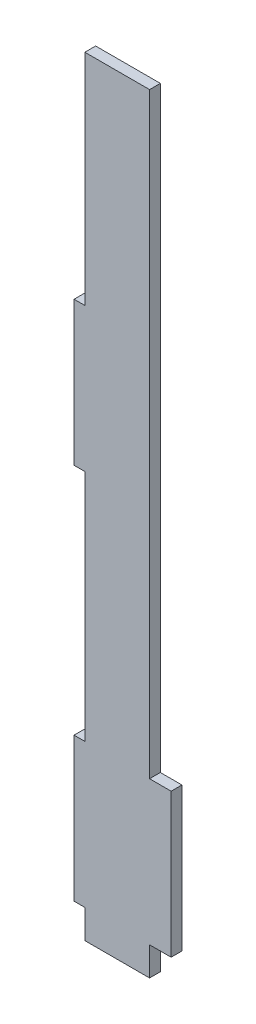
ISO-10303-21;
HEADER;
FILE_DESCRIPTION(('STEP AP214'),'2;1');
FILE_NAME('part.step','',(''),(''),'','','');
FILE_SCHEMA(('AUTOMOTIVE_DESIGN { 1 0 10303 214 1 1 1 1 }'));
ENDSEC;
DATA;
#1=APPLICATION_CONTEXT('core data for automotive mechanical design processes');
#2=APPLICATION_PROTOCOL_DEFINITION('international standard','automotive_design',2000,#1);
#3=PRODUCT_CONTEXT('',#1,'mechanical');
#4=PRODUCT('Part','Part','',(#3));
#5=PRODUCT_RELATED_PRODUCT_CATEGORY('part','',(#4));
#6=PRODUCT_DEFINITION_FORMATION('','',#4);
#7=PRODUCT_DEFINITION_CONTEXT('part definition',#1,'design');
#8=PRODUCT_DEFINITION('design','',#6,#7);
#9=PRODUCT_DEFINITION_SHAPE('','',#8);
#10=(LENGTH_UNIT() NAMED_UNIT(*) SI_UNIT(.MILLI.,.METRE.));
#11=(NAMED_UNIT(*) PLANE_ANGLE_UNIT() SI_UNIT($,.RADIAN.));
#12=(NAMED_UNIT(*) SI_UNIT($,.STERADIAN.) SOLID_ANGLE_UNIT());
#13=UNCERTAINTY_MEASURE_WITH_UNIT(LENGTH_MEASURE(1.E-05),#10,'distance_accuracy_value','');
#14=(GEOMETRIC_REPRESENTATION_CONTEXT(3) GLOBAL_UNCERTAINTY_ASSIGNED_CONTEXT((#13)) GLOBAL_UNIT_ASSIGNED_CONTEXT((#10,
#11,#12)) REPRESENTATION_CONTEXT('',''));
#15=CARTESIAN_POINT('',(0.,0.,0.));
#16=DIRECTION('',(0.,0.,1.));
#17=DIRECTION('',(1.,0.,0.));
#18=AXIS2_PLACEMENT_3D('',#15,#16,#17);
#19=CARTESIAN_POINT('',(-18.,61.,3.));
#20=DIRECTION('',(1.,0.,0.));
#21=DIRECTION('',(0.,1.,0.));
#22=AXIS2_PLACEMENT_3D('',#19,#20,#21);
#23=PLANE('',#22);
#24=DIRECTION('',(0.,-1.,0.));
#25=VECTOR('',#24,1.);
#26=CARTESIAN_POINT('',(-18.,61.,3.));
#27=LINE('',#26,#25);
#28=CARTESIAN_POINT('',(-18.,113.,3.));
#29=VERTEX_POINT('',#28);
#30=CARTESIAN_POINT('',(-18.,48.,3.));
#31=VERTEX_POINT('',#30);
#32=EDGE_CURVE('E50',#29,#31,#27,.T.);
#33=ORIENTED_EDGE('',*,*,#32,.F.);
#34=DIRECTION('',(0.,0.,1.));
#35=VECTOR('',#34,1.);
#36=CARTESIAN_POINT('',(-18.,113.,0.));
#37=LINE('',#36,#35);
#38=CARTESIAN_POINT('',(-18.,113.,0.));
#39=VERTEX_POINT('',#38);
#40=EDGE_CURVE('E179',#39,#29,#37,.T.);
#41=ORIENTED_EDGE('',*,*,#40,.F.);
#42=DIRECTION('',(0.,-1.,0.));
#43=VECTOR('',#42,1.);
#44=CARTESIAN_POINT('',(-18.,61.,0.));
#45=LINE('',#44,#43);
#46=CARTESIAN_POINT('',(-18.,48.,0.));
#47=VERTEX_POINT('',#46);
#48=EDGE_CURVE('E259',#39,#47,#45,.T.);
#49=ORIENTED_EDGE('',*,*,#48,.T.);
#50=DIRECTION('',(0.,0.,1.));
#51=VECTOR('',#50,1.);
#52=CARTESIAN_POINT('',(-18.,48.,-40.4474968323134));
#53=LINE('',#52,#51);
#54=EDGE_CURVE('E201',#47,#31,#53,.T.);
#55=ORIENTED_EDGE('',*,*,#54,.T.);
#56=EDGE_LOOP('',(#33,#41,#49,#55));
#57=FACE_BOUND('',#56,.T.);
#58=ADVANCED_FACE('F35',(#57),#23,.F.);
#59=DIRECTION('',(0.,0.,1.));
#60=VECTOR('',#59,1.);
#61=CARTESIAN_POINT('',(-18.,8.,-40.4474968323134));
#62=LINE('',#61,#60);
#63=CARTESIAN_POINT('',(-18.,8.00000000000001,0.));
#64=VERTEX_POINT('',#63);
#65=CARTESIAN_POINT('',(-18.,8.,3.));
#66=VERTEX_POINT('',#65);
#67=EDGE_CURVE('E203',#64,#66,#62,.T.);
#68=ORIENTED_EDGE('',*,*,#67,.F.);
#69=CARTESIAN_POINT('',(-18.,0.,0.));
#70=VERTEX_POINT('',#69);
#71=EDGE_CURVE('E246',#64,#70,#45,.T.);
#72=ORIENTED_EDGE('',*,*,#71,.T.);
#73=DIRECTION('',(0.,0.,-1.));
#74=VECTOR('',#73,1.);
#75=CARTESIAN_POINT('',(-18.,0.,3.));
#76=LINE('',#75,#74);
#77=CARTESIAN_POINT('',(-18.,0.,3.));
#78=VERTEX_POINT('',#77);
#79=EDGE_CURVE('E11',#78,#70,#76,.T.);
#80=ORIENTED_EDGE('',*,*,#79,.F.);
#81=EDGE_CURVE('E250',#66,#78,#27,.T.);
#82=ORIENTED_EDGE('',*,*,#81,.F.);
#83=EDGE_LOOP('',(#68,#72,#80,#82));
#84=FACE_BOUND('',#83,.T.);
#85=ADVANCED_FACE('F286',(#84),#23,.F.);
#86=CARTESIAN_POINT('',(0.,61.,3.));
#87=DIRECTION('',(-1.,0.,0.));
#88=DIRECTION('',(0.,0.,1.));
#89=AXIS2_PLACEMENT_3D('',#86,#87,#88);
#90=PLANE('',#89);
#91=DIRECTION('',(0.,0.,1.));
#92=VECTOR('',#91,1.);
#93=CARTESIAN_POINT('',(0.,48.,-40.4474968323134));
#94=LINE('',#93,#92);
#95=CARTESIAN_POINT('',(0.,48.,0.));
#96=VERTEX_POINT('',#95);
#97=CARTESIAN_POINT('',(0.,48.,3.));
#98=VERTEX_POINT('',#97);
#99=EDGE_CURVE('E240',#96,#98,#94,.T.);
#100=ORIENTED_EDGE('',*,*,#99,.F.);
#101=DIRECTION('',(0.,1.,0.));
#102=VECTOR('',#101,1.);
#103=CARTESIAN_POINT('',(0.,61.,0.));
#104=LINE('',#103,#102);
#105=CARTESIAN_POINT('',(0.,214.,0.));
#106=VERTEX_POINT('',#105);
#107=EDGE_CURVE('E261',#96,#106,#104,.T.);
#108=ORIENTED_EDGE('',*,*,#107,.T.);
#109=DIRECTION('',(0.,0.,-1.));
#110=VECTOR('',#109,1.);
#111=CARTESIAN_POINT('',(0.,214.,0.));
#112=LINE('',#111,#110);
#113=CARTESIAN_POINT('',(0.,214.,3.));
#114=VERTEX_POINT('',#113);
#115=EDGE_CURVE('E189',#114,#106,#112,.T.);
#116=ORIENTED_EDGE('',*,*,#115,.F.);
#117=DIRECTION('',(0.,1.,0.));
#118=VECTOR('',#117,1.);
#119=CARTESIAN_POINT('',(0.,61.,3.));
#120=LINE('',#119,#118);
#121=EDGE_CURVE('E252',#98,#114,#120,.T.);
#122=ORIENTED_EDGE('',*,*,#121,.F.);
#123=EDGE_LOOP('',(#100,#108,#116,#122));
#124=FACE_BOUND('',#123,.T.);
#125=ADVANCED_FACE('F311',(#124),#90,.F.);
#126=CARTESIAN_POINT('',(-18.,214.,0.));
#127=VERTEX_POINT('',#126);
#128=CARTESIAN_POINT('',(-18.,153.,0.));
#129=VERTEX_POINT('',#128);
#130=EDGE_CURVE('E256',#127,#129,#45,.T.);
#131=ORIENTED_EDGE('',*,*,#130,.T.);
#132=DIRECTION('',(0.,0.,1.));
#133=VECTOR('',#132,1.);
#134=CARTESIAN_POINT('',(-18.,153.,0.));
#135=LINE('',#134,#133);
#136=CARTESIAN_POINT('',(-18.,153.,3.));
#137=VERTEX_POINT('',#136);
#138=EDGE_CURVE('E58',#129,#137,#135,.T.);
#139=ORIENTED_EDGE('',*,*,#138,.T.);
#140=CARTESIAN_POINT('',(-18.,214.,3.));
#141=VERTEX_POINT('',#140);
#142=EDGE_CURVE('E247',#141,#137,#27,.T.);
#143=ORIENTED_EDGE('',*,*,#142,.F.);
#144=DIRECTION('',(0.,0.,1.));
#145=VECTOR('',#144,1.);
#146=CARTESIAN_POINT('',(-18.,214.,0.));
#147=LINE('',#146,#145);
#148=EDGE_CURVE('E181',#127,#141,#147,.T.);
#149=ORIENTED_EDGE('',*,*,#148,.F.);
#150=EDGE_LOOP('',(#131,#139,#143,#149));
#151=FACE_BOUND('',#150,.T.);
#152=ADVANCED_FACE('F37',(#151),#23,.F.);
#153=CARTESIAN_POINT('',(-18.,0.,3.));
#154=DIRECTION('',(0.,1.,0.));
#155=DIRECTION('',(0.,0.,1.));
#156=AXIS2_PLACEMENT_3D('',#153,#154,#155);
#157=PLANE('',#156);
#158=DIRECTION('',(1.,0.,0.));
#159=VECTOR('',#158,1.);
#160=CARTESIAN_POINT('',(-18.,0.,0.));
#161=LINE('',#160,#159);
#162=CARTESIAN_POINT('',(0.,0.,0.));
#163=VERTEX_POINT('',#162);
#164=EDGE_CURVE('E258',#70,#163,#161,.T.);
#165=ORIENTED_EDGE('',*,*,#164,.T.);
#166=DIRECTION('',(0.,0.,-1.));
#167=VECTOR('',#166,1.);
#168=CARTESIAN_POINT('',(0.,0.,3.));
#169=LINE('',#168,#167);
#170=CARTESIAN_POINT('',(0.,0.,3.));
#171=VERTEX_POINT('',#170);
#172=EDGE_CURVE('E43',#171,#163,#169,.T.);
#173=ORIENTED_EDGE('',*,*,#172,.F.);
#174=DIRECTION('',(1.,0.,0.));
#175=VECTOR('',#174,1.);
#176=CARTESIAN_POINT('',(-18.,0.,3.));
#177=LINE('',#176,#175);
#178=EDGE_CURVE('E249',#78,#171,#177,.T.);
#179=ORIENTED_EDGE('',*,*,#178,.F.);
#180=ORIENTED_EDGE('',*,*,#79,.T.);
#181=EDGE_LOOP('',(#165,#173,#179,#180));
#182=FACE_BOUND('',#181,.T.);
#183=ADVANCED_FACE('F284',(#182),#157,.F.);
#184=CARTESIAN_POINT('',(0.,8.,0.));
#185=VERTEX_POINT('',#184);
#186=EDGE_CURVE('E262',#163,#185,#104,.T.);
#187=ORIENTED_EDGE('',*,*,#186,.T.);
#188=DIRECTION('',(0.,0.,1.));
#189=VECTOR('',#188,1.);
#190=CARTESIAN_POINT('',(0.,8.,-40.4474968323134));
#191=LINE('',#190,#189);
#192=CARTESIAN_POINT('',(0.,8.00000000000001,3.));
#193=VERTEX_POINT('',#192);
#194=EDGE_CURVE('E226',#185,#193,#191,.T.);
#195=ORIENTED_EDGE('',*,*,#194,.T.);
#196=EDGE_CURVE('E253',#171,#193,#120,.T.);
#197=ORIENTED_EDGE('',*,*,#196,.F.);
#198=ORIENTED_EDGE('',*,*,#172,.T.);
#199=EDGE_LOOP('',(#187,#195,#197,#198));
#200=FACE_BOUND('',#199,.T.);
#201=ADVANCED_FACE('F269',(#200),#90,.F.);
#202=CARTESIAN_POINT('',(0.,0.,3.));
#203=DIRECTION('',(0.,0.,1.));
#204=DIRECTION('',(1.,0.,0.));
#205=AXIS2_PLACEMENT_3D('',#202,#203,#204);
#206=PLANE('',#205);
#207=ORIENTED_EDGE('',*,*,#142,.T.);
#208=DIRECTION('',(-1.,0.,0.));
#209=VECTOR('',#208,1.);
#210=CARTESIAN_POINT('',(-18.,153.,3.));
#211=LINE('',#210,#209);
#212=CARTESIAN_POINT('',(-21.,153.,3.));
#213=VERTEX_POINT('',#212);
#214=EDGE_CURVE('E176',#137,#213,#211,.T.);
#215=ORIENTED_EDGE('',*,*,#214,.T.);
#216=DIRECTION('',(0.,-1.,0.));
#217=VECTOR('',#216,1.);
#218=CARTESIAN_POINT('',(-21.,113.,3.));
#219=LINE('',#218,#217);
#220=CARTESIAN_POINT('',(-21.,113.,3.));
#221=VERTEX_POINT('',#220);
#222=EDGE_CURVE('E155',#213,#221,#219,.T.);
#223=ORIENTED_EDGE('',*,*,#222,.T.);
#224=DIRECTION('',(1.,0.,0.));
#225=VECTOR('',#224,1.);
#226=CARTESIAN_POINT('',(-18.,113.,3.));
#227=LINE('',#226,#225);
#228=EDGE_CURVE('E170',#221,#29,#227,.T.);
#229=ORIENTED_EDGE('',*,*,#228,.T.);
#230=ORIENTED_EDGE('',*,*,#32,.T.);
#231=DIRECTION('',(-1.,0.,0.));
#232=VECTOR('',#231,1.);
#233=CARTESIAN_POINT('',(-18.,48.,3.));
#234=LINE('',#233,#232);
#235=CARTESIAN_POINT('',(-21.,48.,3.));
#236=VERTEX_POINT('',#235);
#237=EDGE_CURVE('E206',#31,#236,#234,.T.);
#238=ORIENTED_EDGE('',*,*,#237,.T.);
#239=DIRECTION('',(0.,1.,0.));
#240=VECTOR('',#239,1.);
#241=CARTESIAN_POINT('',(-21.,8.,3.));
#242=LINE('',#241,#240);
#243=CARTESIAN_POINT('',(-21.,8.,3.));
#244=VERTEX_POINT('',#243);
#245=EDGE_CURVE('E209',#244,#236,#242,.T.);
#246=ORIENTED_EDGE('',*,*,#245,.F.);
#247=DIRECTION('',(-1.,0.,0.));
#248=VECTOR('',#247,1.);
#249=CARTESIAN_POINT('',(-18.,8.,3.));
#250=LINE('',#249,#248);
#251=EDGE_CURVE('E212',#66,#244,#250,.T.);
#252=ORIENTED_EDGE('',*,*,#251,.F.);
#253=ORIENTED_EDGE('',*,*,#81,.T.);
#254=ORIENTED_EDGE('',*,*,#178,.T.);
#255=ORIENTED_EDGE('',*,*,#196,.T.);
#256=DIRECTION('',(1.,0.,0.));
#257=VECTOR('',#256,1.);
#258=CARTESIAN_POINT('',(0.,8.,3.));
#259=LINE('',#258,#257);
#260=CARTESIAN_POINT('',(6.,8.,3.));
#261=VERTEX_POINT('',#260);
#262=EDGE_CURVE('E215',#193,#261,#259,.T.);
#263=ORIENTED_EDGE('',*,*,#262,.T.);
#264=DIRECTION('',(0.,1.,0.));
#265=VECTOR('',#264,1.);
#266=CARTESIAN_POINT('',(6.,0.,3.));
#267=LINE('',#266,#265);
#268=CARTESIAN_POINT('',(6.,48.,3.));
#269=VERTEX_POINT('',#268);
#270=EDGE_CURVE('E231',#261,#269,#267,.T.);
#271=ORIENTED_EDGE('',*,*,#270,.T.);
#272=DIRECTION('',(1.,0.,0.));
#273=VECTOR('',#272,1.);
#274=CARTESIAN_POINT('',(0.,48.,3.));
#275=LINE('',#274,#273);
#276=EDGE_CURVE('E234',#98,#269,#275,.T.);
#277=ORIENTED_EDGE('',*,*,#276,.F.);
#278=ORIENTED_EDGE('',*,*,#121,.T.);
#279=DIRECTION('',(1.,0.,0.));
#280=VECTOR('',#279,1.);
#281=CARTESIAN_POINT('',(-18.,214.,3.));
#282=LINE('',#281,#280);
#283=EDGE_CURVE('E186',#141,#114,#282,.T.);
#284=ORIENTED_EDGE('',*,*,#283,.F.);
#285=EDGE_LOOP('',(#207,#215,#223,#229,#230,#238,#246,#252,#253,#254,#255,#263,#271,#277,#278,#284));
#286=FACE_BOUND('',#285,.T.);
#287=ADVANCED_FACE('F281',(#286),#206,.T.);
#288=CARTESIAN_POINT('',(0.,0.,0.));
#289=DIRECTION('',(0.,0.,1.));
#290=DIRECTION('',(1.,0.,0.));
#291=AXIS2_PLACEMENT_3D('',#288,#289,#290);
#292=PLANE('',#291);
#293=ORIENTED_EDGE('',*,*,#130,.F.);
#294=DIRECTION('',(-1.,0.,0.));
#295=VECTOR('',#294,1.);
#296=CARTESIAN_POINT('',(-18.,214.,0.));
#297=LINE('',#296,#295);
#298=EDGE_CURVE('E192',#106,#127,#297,.T.);
#299=ORIENTED_EDGE('',*,*,#298,.F.);
#300=ORIENTED_EDGE('',*,*,#107,.F.);
#301=DIRECTION('',(-1.,0.,0.));
#302=VECTOR('',#301,1.);
#303=CARTESIAN_POINT('',(0.,48.,0.));
#304=LINE('',#303,#302);
#305=CARTESIAN_POINT('',(6.,48.,0.));
#306=VERTEX_POINT('',#305);
#307=EDGE_CURVE('E223',#306,#96,#304,.T.);
#308=ORIENTED_EDGE('',*,*,#307,.F.);
#309=DIRECTION('',(0.,-1.,0.));
#310=VECTOR('',#309,1.);
#311=CARTESIAN_POINT('',(6.,0.,0.));
#312=LINE('',#311,#310);
#313=CARTESIAN_POINT('',(6.,8.,0.));
#314=VERTEX_POINT('',#313);
#315=EDGE_CURVE('E228',#306,#314,#312,.T.);
#316=ORIENTED_EDGE('',*,*,#315,.T.);
#317=DIRECTION('',(-1.,0.,0.));
#318=VECTOR('',#317,1.);
#319=CARTESIAN_POINT('',(0.,8.,0.));
#320=LINE('',#319,#318);
#321=EDGE_CURVE('E225',#314,#185,#320,.T.);
#322=ORIENTED_EDGE('',*,*,#321,.T.);
#323=ORIENTED_EDGE('',*,*,#186,.F.);
#324=ORIENTED_EDGE('',*,*,#164,.F.);
#325=ORIENTED_EDGE('',*,*,#71,.F.);
#326=DIRECTION('',(1.,0.,0.));
#327=VECTOR('',#326,1.);
#328=CARTESIAN_POINT('',(-18.,8.,0.));
#329=LINE('',#328,#327);
#330=CARTESIAN_POINT('',(-21.,8.,0.));
#331=VERTEX_POINT('',#330);
#332=EDGE_CURVE('E195',#331,#64,#329,.T.);
#333=ORIENTED_EDGE('',*,*,#332,.F.);
#334=DIRECTION('',(0.,-1.,0.));
#335=VECTOR('',#334,1.);
#336=CARTESIAN_POINT('',(-21.,8.,0.));
#337=LINE('',#336,#335);
#338=CARTESIAN_POINT('',(-21.,48.,0.));
#339=VERTEX_POINT('',#338);
#340=EDGE_CURVE('E218',#339,#331,#337,.T.);
#341=ORIENTED_EDGE('',*,*,#340,.F.);
#342=DIRECTION('',(1.,0.,0.));
#343=VECTOR('',#342,1.);
#344=CARTESIAN_POINT('',(-18.,48.,0.));
#345=LINE('',#344,#343);
#346=EDGE_CURVE('E199',#339,#47,#345,.T.);
#347=ORIENTED_EDGE('',*,*,#346,.T.);
#348=ORIENTED_EDGE('',*,*,#48,.F.);
#349=DIRECTION('',(1.,0.,0.));
#350=VECTOR('',#349,1.);
#351=CARTESIAN_POINT('',(-18.,113.,0.));
#352=LINE('',#351,#350);
#353=CARTESIAN_POINT('',(-21.,113.,0.));
#354=VERTEX_POINT('',#353);
#355=EDGE_CURVE('E167',#354,#39,#352,.T.);
#356=ORIENTED_EDGE('',*,*,#355,.F.);
#357=DIRECTION('',(0.,-1.,0.));
#358=VECTOR('',#357,1.);
#359=CARTESIAN_POINT('',(-21.,113.,0.));
#360=LINE('',#359,#358);
#361=CARTESIAN_POINT('',(-21.,153.,0.));
#362=VERTEX_POINT('',#361);
#363=EDGE_CURVE('E152',#362,#354,#360,.T.);
#364=ORIENTED_EDGE('',*,*,#363,.F.);
#365=DIRECTION('',(-1.,0.,0.));
#366=VECTOR('',#365,1.);
#367=CARTESIAN_POINT('',(-18.,153.,0.));
#368=LINE('',#367,#366);
#369=EDGE_CURVE('E165',#129,#362,#368,.T.);
#370=ORIENTED_EDGE('',*,*,#369,.F.);
#371=EDGE_LOOP('',(#293,#299,#300,#308,#316,#322,#323,#324,#325,#333,#341,#347,#348,#356,#364,#370));
#372=FACE_BOUND('',#371,.T.);
#373=ADVANCED_FACE('F164',(#372),#292,.F.);
#374=CARTESIAN_POINT('',(0.,8.,-40.4474968323134));
#375=DIRECTION('',(0.,-1.,0.));
#376=DIRECTION('',(0.,0.,-1.));
#377=AXIS2_PLACEMENT_3D('',#374,#375,#376);
#378=PLANE('',#377);
#379=ORIENTED_EDGE('',*,*,#321,.F.);
#380=DIRECTION('',(0.,0.,1.));
#381=VECTOR('',#380,1.);
#382=CARTESIAN_POINT('',(6.,8.,-40.4474968323134));
#383=LINE('',#382,#381);
#384=EDGE_CURVE('E237',#314,#261,#383,.T.);
#385=ORIENTED_EDGE('',*,*,#384,.T.);
#386=ORIENTED_EDGE('',*,*,#262,.F.);
#387=ORIENTED_EDGE('',*,*,#194,.F.);
#388=EDGE_LOOP('',(#379,#385,#386,#387));
#389=FACE_BOUND('',#388,.T.);
#390=ADVANCED_FACE('F279',(#389),#378,.T.);
#391=CARTESIAN_POINT('',(0.,48.,-40.4474968323134));
#392=DIRECTION('',(0.,-1.,0.));
#393=DIRECTION('',(0.,0.,-1.));
#394=AXIS2_PLACEMENT_3D('',#391,#392,#393);
#395=PLANE('',#394);
#396=DIRECTION('',(0.,0.,1.));
#397=VECTOR('',#396,1.);
#398=CARTESIAN_POINT('',(6.,48.,-40.4474968323134));
#399=LINE('',#398,#397);
#400=EDGE_CURVE('E242',#306,#269,#399,.T.);
#401=ORIENTED_EDGE('',*,*,#400,.F.);
#402=ORIENTED_EDGE('',*,*,#307,.T.);
#403=ORIENTED_EDGE('',*,*,#99,.T.);
#404=ORIENTED_EDGE('',*,*,#276,.T.);
#405=EDGE_LOOP('',(#401,#402,#403,#404));
#406=FACE_BOUND('',#405,.T.);
#407=ADVANCED_FACE('F328',(#406),#395,.F.);
#408=CARTESIAN_POINT('',(6.,0.,-40.4474968323134));
#409=DIRECTION('',(1.,0.,0.));
#410=DIRECTION('',(0.,0.,-1.));
#411=AXIS2_PLACEMENT_3D('',#408,#409,#410);
#412=PLANE('',#411);
#413=ORIENTED_EDGE('',*,*,#315,.F.);
#414=ORIENTED_EDGE('',*,*,#400,.T.);
#415=ORIENTED_EDGE('',*,*,#270,.F.);
#416=ORIENTED_EDGE('',*,*,#384,.F.);
#417=EDGE_LOOP('',(#413,#414,#415,#416));
#418=FACE_BOUND('',#417,.T.);
#419=ADVANCED_FACE('F332',(#418),#412,.T.);
#420=CARTESIAN_POINT('',(-18.,8.,-40.4474968323134));
#421=DIRECTION('',(0.,1.,0.));
#422=DIRECTION('',(0.,0.,1.));
#423=AXIS2_PLACEMENT_3D('',#420,#421,#422);
#424=PLANE('',#423);
#425=DIRECTION('',(0.,0.,1.));
#426=VECTOR('',#425,1.);
#427=CARTESIAN_POINT('',(-21.,8.,-40.4474968323134));
#428=LINE('',#427,#426);
#429=EDGE_CURVE('E196',#331,#244,#428,.T.);
#430=ORIENTED_EDGE('',*,*,#429,.F.);
#431=ORIENTED_EDGE('',*,*,#332,.T.);
#432=ORIENTED_EDGE('',*,*,#67,.T.);
#433=ORIENTED_EDGE('',*,*,#251,.T.);
#434=EDGE_LOOP('',(#430,#431,#432,#433));
#435=FACE_BOUND('',#434,.T.);
#436=ADVANCED_FACE('F334',(#435),#424,.F.);
#437=CARTESIAN_POINT('',(-21.,8.,-40.4474968323134));
#438=DIRECTION('',(1.,0.,0.));
#439=DIRECTION('',(0.,0.,-1.));
#440=AXIS2_PLACEMENT_3D('',#437,#438,#439);
#441=PLANE('',#440);
#442=DIRECTION('',(0.,0.,1.));
#443=VECTOR('',#442,1.);
#444=CARTESIAN_POINT('',(-21.,48.,-40.4474968323134));
#445=LINE('',#444,#443);
#446=EDGE_CURVE('E198',#339,#236,#445,.T.);
#447=ORIENTED_EDGE('',*,*,#446,.F.);
#448=ORIENTED_EDGE('',*,*,#340,.T.);
#449=ORIENTED_EDGE('',*,*,#429,.T.);
#450=ORIENTED_EDGE('',*,*,#245,.T.);
#451=EDGE_LOOP('',(#447,#448,#449,#450));
#452=FACE_BOUND('',#451,.T.);
#453=ADVANCED_FACE('F340',(#452),#441,.F.);
#454=CARTESIAN_POINT('',(-18.,48.,-40.4474968323134));
#455=DIRECTION('',(0.,1.,0.));
#456=DIRECTION('',(0.,0.,1.));
#457=AXIS2_PLACEMENT_3D('',#454,#455,#456);
#458=PLANE('',#457);
#459=ORIENTED_EDGE('',*,*,#346,.F.);
#460=ORIENTED_EDGE('',*,*,#446,.T.);
#461=ORIENTED_EDGE('',*,*,#237,.F.);
#462=ORIENTED_EDGE('',*,*,#54,.F.);
#463=EDGE_LOOP('',(#459,#460,#461,#462));
#464=FACE_BOUND('',#463,.T.);
#465=ADVANCED_FACE('F292',(#464),#458,.T.);
#466=CARTESIAN_POINT('',(0.,214.,0.));
#467=DIRECTION('',(0.,1.,0.));
#468=DIRECTION('',(0.,0.,1.));
#469=AXIS2_PLACEMENT_3D('',#466,#467,#468);
#470=PLANE('',#469);
#471=ORIENTED_EDGE('',*,*,#148,.T.);
#472=ORIENTED_EDGE('',*,*,#283,.T.);
#473=ORIENTED_EDGE('',*,*,#115,.T.);
#474=ORIENTED_EDGE('',*,*,#298,.T.);
#475=EDGE_LOOP('',(#471,#472,#473,#474));
#476=FACE_BOUND('',#475,.T.);
#477=ADVANCED_FACE('F298',(#476),#470,.T.);
#478=CARTESIAN_POINT('',(-18.,113.,0.));
#479=DIRECTION('',(0.,-1.,0.));
#480=DIRECTION('',(0.,0.,-1.));
#481=AXIS2_PLACEMENT_3D('',#478,#479,#480);
#482=PLANE('',#481);
#483=ORIENTED_EDGE('',*,*,#228,.F.);
#484=DIRECTION('',(0.,0.,1.));
#485=VECTOR('',#484,1.);
#486=CARTESIAN_POINT('',(-21.,113.,0.));
#487=LINE('',#486,#485);
#488=EDGE_CURVE('E160',#354,#221,#487,.T.);
#489=ORIENTED_EDGE('',*,*,#488,.F.);
#490=ORIENTED_EDGE('',*,*,#355,.T.);
#491=ORIENTED_EDGE('',*,*,#40,.T.);
#492=EDGE_LOOP('',(#483,#489,#490,#491));
#493=FACE_BOUND('',#492,.T.);
#494=ADVANCED_FACE('F296',(#493),#482,.T.);
#495=CARTESIAN_POINT('',(-21.,113.,0.));
#496=DIRECTION('',(-1.,0.,0.));
#497=DIRECTION('',(0.,0.,1.));
#498=AXIS2_PLACEMENT_3D('',#495,#496,#497);
#499=PLANE('',#498);
#500=ORIENTED_EDGE('',*,*,#222,.F.);
#501=DIRECTION('',(0.,0.,1.));
#502=VECTOR('',#501,1.);
#503=CARTESIAN_POINT('',(-21.,153.,0.));
#504=LINE('',#503,#502);
#505=EDGE_CURVE('E149',#362,#213,#504,.T.);
#506=ORIENTED_EDGE('',*,*,#505,.F.);
#507=ORIENTED_EDGE('',*,*,#363,.T.);
#508=ORIENTED_EDGE('',*,*,#488,.T.);
#509=EDGE_LOOP('',(#500,#506,#507,#508));
#510=FACE_BOUND('',#509,.T.);
#511=ADVANCED_FACE('F151',(#510),#499,.T.);
#512=CARTESIAN_POINT('',(-18.,153.,0.));
#513=DIRECTION('',(0.,1.,0.));
#514=DIRECTION('',(0.,0.,1.));
#515=AXIS2_PLACEMENT_3D('',#512,#513,#514);
#516=PLANE('',#515);
#517=ORIENTED_EDGE('',*,*,#214,.F.);
#518=ORIENTED_EDGE('',*,*,#138,.F.);
#519=ORIENTED_EDGE('',*,*,#369,.T.);
#520=ORIENTED_EDGE('',*,*,#505,.T.);
#521=EDGE_LOOP('',(#517,#518,#519,#520));
#522=FACE_BOUND('',#521,.T.);
#523=ADVANCED_FACE('F169',(#522),#516,.T.);
#524=CLOSED_SHELL('',(#58,#85,#125,#152,#183,#201,#287,#373,#390,#407,#419,#436,#453,#465,#477,
#494,#511,#523));
#525=MANIFOLD_SOLID_BREP('B2',#524);
#526=ADVANCED_BREP_SHAPE_REPRESENTATION('',(#18,#525),#14);
#527=SHAPE_DEFINITION_REPRESENTATION(#9,#526);
ENDSEC;
END-ISO-10303-21;
